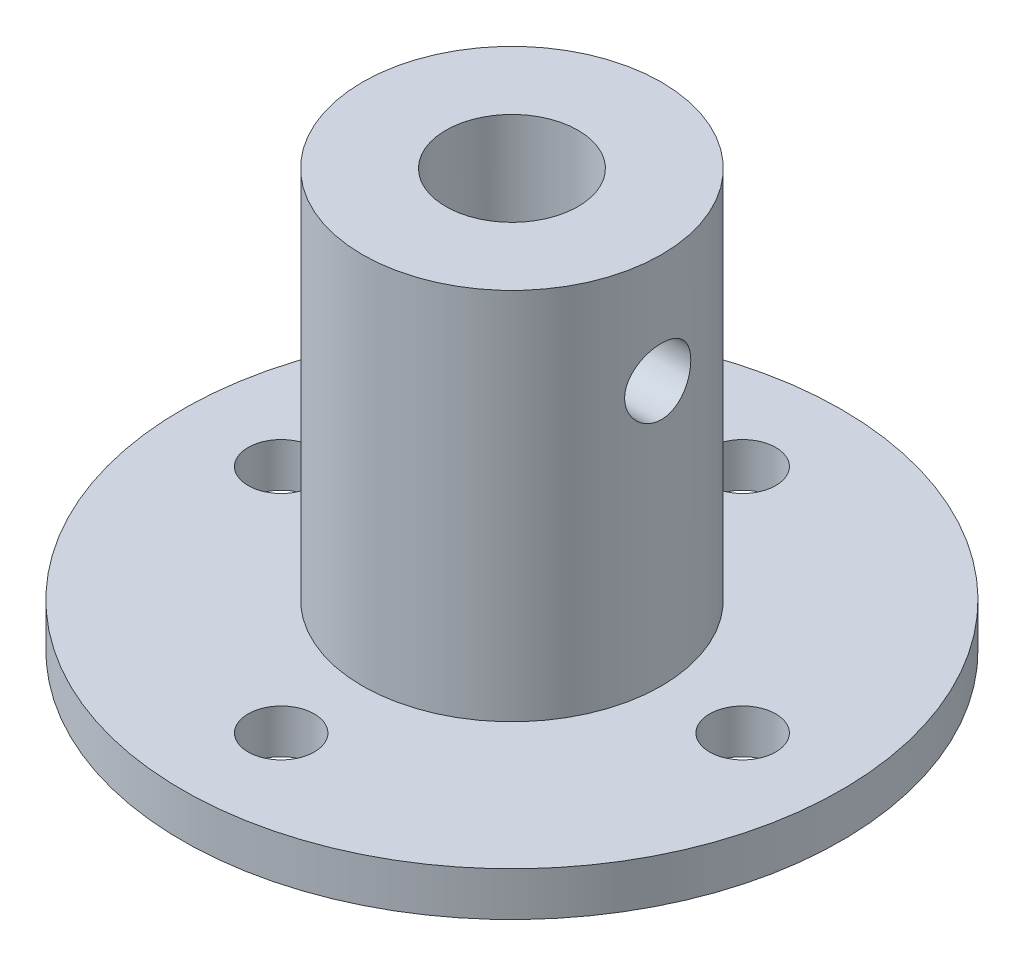
ISO-10303-21;
HEADER;
FILE_DESCRIPTION(('STEP AP214'),'2;1');
FILE_NAME('part.step','',(''),(''),'','','');
FILE_SCHEMA(('AUTOMOTIVE_DESIGN { 1 0 10303 214 1 1 1 1 }'));
ENDSEC;
DATA;
#1=APPLICATION_CONTEXT('core data for automotive mechanical design processes');
#2=APPLICATION_PROTOCOL_DEFINITION('international standard','automotive_design',2000,#1);
#3=PRODUCT_CONTEXT('',#1,'mechanical');
#4=PRODUCT('Part','Part','',(#3));
#5=PRODUCT_RELATED_PRODUCT_CATEGORY('part','',(#4));
#6=PRODUCT_DEFINITION_FORMATION('','',#4);
#7=PRODUCT_DEFINITION_CONTEXT('part definition',#1,'design');
#8=PRODUCT_DEFINITION('design','',#6,#7);
#9=PRODUCT_DEFINITION_SHAPE('','',#8);
#10=(LENGTH_UNIT() NAMED_UNIT(*) SI_UNIT(.MILLI.,.METRE.));
#11=(NAMED_UNIT(*) PLANE_ANGLE_UNIT() SI_UNIT($,.RADIAN.));
#12=(NAMED_UNIT(*) SI_UNIT($,.STERADIAN.) SOLID_ANGLE_UNIT());
#13=UNCERTAINTY_MEASURE_WITH_UNIT(LENGTH_MEASURE(1.E-05),#10,'distance_accuracy_value','');
#14=(GEOMETRIC_REPRESENTATION_CONTEXT(3) GLOBAL_UNCERTAINTY_ASSIGNED_CONTEXT((#13)) GLOBAL_UNIT_ASSIGNED_CONTEXT((#10,
#11,#12)) REPRESENTATION_CONTEXT('',''));
#15=CARTESIAN_POINT('',(0.,0.,0.));
#16=DIRECTION('',(0.,0.,1.));
#17=DIRECTION('',(1.,0.,0.));
#18=AXIS2_PLACEMENT_3D('',#15,#16,#17);
#19=CARTESIAN_POINT('',(0.,1.5875,-21.8080060784619));
#20=DIRECTION('',(0.,1.,0.));
#21=DIRECTION('',(0.,0.,1.));
#22=AXIS2_PLACEMENT_3D('',#19,#20,#21);
#23=PLANE('',#22);
#24=CARTESIAN_POINT('',(8.3312,1.5875,0.));
#25=DIRECTION('',(0.,1.,0.));
#26=DIRECTION('',(0.,0.,1.));
#27=AXIS2_PLACEMENT_3D('',#24,#25,#26);
#28=CIRCLE('',#27,1.1938);
#29=CARTESIAN_POINT('',(8.3312,1.5875,1.1938));
#30=VERTEX_POINT('',#29);
#31=EDGE_CURVE('E129',#30,#30,#28,.F.);
#32=ORIENTED_EDGE('',*,*,#31,.F.);
#33=EDGE_LOOP('',(#32));
#34=FACE_BOUND('',#33,.T.);
#35=CARTESIAN_POINT('',(-8.3312,1.5875,0.));
#36=DIRECTION('',(0.,1.,0.));
#37=DIRECTION('',(0.,0.,1.));
#38=AXIS2_PLACEMENT_3D('',#35,#36,#37);
#39=CIRCLE('',#38,1.1938);
#40=CARTESIAN_POINT('',(-8.3312,1.5875,1.1938));
#41=VERTEX_POINT('',#40);
#42=EDGE_CURVE('E56',#41,#41,#39,.F.);
#43=ORIENTED_EDGE('',*,*,#42,.F.);
#44=EDGE_LOOP('',(#43));
#45=FACE_BOUND('',#44,.T.);
#46=CARTESIAN_POINT('',(0.,1.5875,0.));
#47=DIRECTION('',(0.,-1.,0.));
#48=DIRECTION('',(0.,0.,-1.));
#49=AXIS2_PLACEMENT_3D('',#46,#47,#48);
#50=CIRCLE('',#49,3.9243);
#51=CARTESIAN_POINT('',(0.,1.5875,-3.9243));
#52=VERTEX_POINT('',#51);
#53=EDGE_CURVE('E39',#52,#52,#50,.T.);
#54=ORIENTED_EDGE('',*,*,#53,.F.);
#55=EDGE_LOOP('',(#54));
#56=FACE_BOUND('',#55,.T.);
#57=CARTESIAN_POINT('',(0.,1.5875,0.));
#58=DIRECTION('',(0.,-1.,0.));
#59=DIRECTION('',(0.,0.,-1.));
#60=AXIS2_PLACEMENT_3D('',#57,#58,#59);
#61=CIRCLE('',#60,11.8999);
#62=CARTESIAN_POINT('',(0.,1.5875,-11.8999));
#63=VERTEX_POINT('',#62);
#64=EDGE_CURVE('E44',#63,#63,#61,.T.);
#65=ORIENTED_EDGE('',*,*,#64,.T.);
#66=EDGE_LOOP('',(#65));
#67=FACE_BOUND('',#66,.T.);
#68=CARTESIAN_POINT('',(0.,1.5875,-8.3312));
#69=DIRECTION('',(0.,1.,0.));
#70=DIRECTION('',(0.,0.,1.));
#71=AXIS2_PLACEMENT_3D('',#68,#69,#70);
#72=CIRCLE('',#71,1.1938);
#73=CARTESIAN_POINT('',(0.,1.5875,-7.1374));
#74=VERTEX_POINT('',#73);
#75=EDGE_CURVE('E121',#74,#74,#72,.F.);
#76=ORIENTED_EDGE('',*,*,#75,.F.);
#77=EDGE_LOOP('',(#76));
#78=FACE_BOUND('',#77,.T.);
#79=CARTESIAN_POINT('',(0.,1.5875,8.3312));
#80=DIRECTION('',(0.,1.,0.));
#81=DIRECTION('',(0.,0.,1.));
#82=AXIS2_PLACEMENT_3D('',#79,#80,#81);
#83=CIRCLE('',#82,1.1938);
#84=CARTESIAN_POINT('',(0.,1.5875,9.525));
#85=VERTEX_POINT('',#84);
#86=EDGE_CURVE('E124',#85,#85,#83,.F.);
#87=ORIENTED_EDGE('',*,*,#86,.F.);
#88=EDGE_LOOP('',(#87));
#89=FACE_BOUND('',#88,.T.);
#90=ADVANCED_FACE('F31',(#34,#45,#56,#67,#78,#89),#23,.F.);
#91=CARTESIAN_POINT('',(0.,3.175,-21.8080060784619));
#92=DIRECTION('',(0.,-1.,0.));
#93=DIRECTION('',(0.,0.,-1.));
#94=AXIS2_PLACEMENT_3D('',#91,#92,#93);
#95=PLANE('',#94);
#96=CARTESIAN_POINT('',(8.3312,3.175,0.));
#97=DIRECTION('',(0.,-1.,0.));
#98=DIRECTION('',(0.,0.,-1.));
#99=AXIS2_PLACEMENT_3D('',#96,#97,#98);
#100=CIRCLE('',#99,1.1938);
#101=CARTESIAN_POINT('',(8.3312,3.175,-1.1938));
#102=VERTEX_POINT('',#101);
#103=EDGE_CURVE('E126',#102,#102,#100,.F.);
#104=ORIENTED_EDGE('',*,*,#103,.F.);
#105=EDGE_LOOP('',(#104));
#106=FACE_BOUND('',#105,.T.);
#107=CARTESIAN_POINT('',(-8.3312,3.175,0.));
#108=DIRECTION('',(0.,-1.,0.));
#109=DIRECTION('',(0.,0.,-1.));
#110=AXIS2_PLACEMENT_3D('',#107,#108,#109);
#111=CIRCLE('',#110,1.1938);
#112=CARTESIAN_POINT('',(-8.3312,3.175,-1.1938));
#113=VERTEX_POINT('',#112);
#114=EDGE_CURVE('E134',#113,#113,#111,.F.);
#115=ORIENTED_EDGE('',*,*,#114,.F.);
#116=EDGE_LOOP('',(#115));
#117=FACE_BOUND('',#116,.T.);
#118=CARTESIAN_POINT('',(0.,3.175,0.));
#119=DIRECTION('',(0.,-1.,0.));
#120=DIRECTION('',(0.,0.,-1.));
#121=AXIS2_PLACEMENT_3D('',#118,#119,#120);
#122=CIRCLE('',#121,11.8999);
#123=CARTESIAN_POINT('',(0.,3.175,-11.8999));
#124=VERTEX_POINT('',#123);
#125=EDGE_CURVE('E172',#124,#124,#122,.T.);
#126=ORIENTED_EDGE('',*,*,#125,.F.);
#127=EDGE_LOOP('',(#126));
#128=FACE_BOUND('',#127,.T.);
#129=CARTESIAN_POINT('',(0.,3.175,0.));
#130=DIRECTION('',(0.,-1.,0.));
#131=DIRECTION('',(0.,0.,-1.));
#132=AXIS2_PLACEMENT_3D('',#129,#130,#131);
#133=CIRCLE('',#132,5.3975);
#134=CARTESIAN_POINT('',(0.,3.175,-5.3975));
#135=VERTEX_POINT('',#134);
#136=EDGE_CURVE('E175',#135,#135,#133,.T.);
#137=ORIENTED_EDGE('',*,*,#136,.T.);
#138=EDGE_LOOP('',(#137));
#139=FACE_BOUND('',#138,.T.);
#140=CARTESIAN_POINT('',(0.,3.175,-8.3312));
#141=DIRECTION('',(0.,-1.,0.));
#142=DIRECTION('',(0.,0.,-1.));
#143=AXIS2_PLACEMENT_3D('',#140,#141,#142);
#144=CIRCLE('',#143,1.1938);
#145=CARTESIAN_POINT('',(0.,3.175,-9.525));
#146=VERTEX_POINT('',#145);
#147=EDGE_CURVE('E133',#146,#146,#144,.F.);
#148=ORIENTED_EDGE('',*,*,#147,.F.);
#149=EDGE_LOOP('',(#148));
#150=FACE_BOUND('',#149,.T.);
#151=CARTESIAN_POINT('',(0.,3.175,8.3312));
#152=DIRECTION('',(0.,-1.,0.));
#153=DIRECTION('',(0.,0.,-1.));
#154=AXIS2_PLACEMENT_3D('',#151,#152,#153);
#155=CIRCLE('',#154,1.1938);
#156=CARTESIAN_POINT('',(0.,3.175,7.1374));
#157=VERTEX_POINT('',#156);
#158=EDGE_CURVE('E35',#157,#157,#155,.F.);
#159=ORIENTED_EDGE('',*,*,#158,.F.);
#160=EDGE_LOOP('',(#159));
#161=FACE_BOUND('',#160,.T.);
#162=ADVANCED_FACE('F94',(#106,#117,#128,#139,#150,#161),#95,.F.);
#163=CARTESIAN_POINT('',(0.,0.,-21.8080060784619));
#164=DIRECTION('',(0.,1.,0.));
#165=DIRECTION('',(0.,0.,1.));
#166=AXIS2_PLACEMENT_3D('',#163,#164,#165);
#167=PLANE('',#166);
#168=CARTESIAN_POINT('',(0.,0.,0.));
#169=DIRECTION('',(0.,-1.,0.));
#170=DIRECTION('',(0.,0.,-1.));
#171=AXIS2_PLACEMENT_3D('',#168,#169,#170);
#172=CIRCLE('',#171,2.3876);
#173=CARTESIAN_POINT('',(0.,0.,-2.3876));
#174=VERTEX_POINT('',#173);
#175=EDGE_CURVE('E185',#174,#174,#172,.T.);
#176=ORIENTED_EDGE('',*,*,#175,.F.);
#177=EDGE_LOOP('',(#176));
#178=FACE_BOUND('',#177,.T.);
#179=CARTESIAN_POINT('',(0.,0.,0.));
#180=DIRECTION('',(0.,-1.,0.));
#181=DIRECTION('',(0.,0.,-1.));
#182=AXIS2_PLACEMENT_3D('',#179,#180,#181);
#183=CIRCLE('',#182,3.9243);
#184=CARTESIAN_POINT('',(0.,0.,-3.9243));
#185=VERTEX_POINT('',#184);
#186=EDGE_CURVE('E10',#185,#185,#183,.T.);
#187=ORIENTED_EDGE('',*,*,#186,.T.);
#188=EDGE_LOOP('',(#187));
#189=FACE_BOUND('',#188,.T.);
#190=ADVANCED_FACE('F33',(#178,#189),#167,.F.);
#191=CARTESIAN_POINT('',(0.,0.,0.));
#192=DIRECTION('',(0.,-1.,0.));
#193=DIRECTION('',(0.,0.,-1.));
#194=AXIS2_PLACEMENT_3D('',#191,#192,#193);
#195=CYLINDRICAL_SURFACE('',#194,3.9243);
#196=ORIENTED_EDGE('',*,*,#186,.F.);
#197=EDGE_LOOP('',(#196));
#198=FACE_BOUND('',#197,.T.);
#199=ORIENTED_EDGE('',*,*,#53,.T.);
#200=EDGE_LOOP('',(#199));
#201=FACE_BOUND('',#200,.T.);
#202=ADVANCED_FACE('F101',(#198,#201),#195,.T.);
#203=CARTESIAN_POINT('',(0.,0.,0.));
#204=DIRECTION('',(0.,-1.,0.));
#205=DIRECTION('',(0.,0.,-1.));
#206=AXIS2_PLACEMENT_3D('',#203,#204,#205);
#207=CYLINDRICAL_SURFACE('',#206,11.8999);
#208=ORIENTED_EDGE('',*,*,#64,.F.);
#209=EDGE_LOOP('',(#208));
#210=FACE_BOUND('',#209,.T.);
#211=ORIENTED_EDGE('',*,*,#125,.T.);
#212=EDGE_LOOP('',(#211));
#213=FACE_BOUND('',#212,.T.);
#214=ADVANCED_FACE('F92',(#210,#213),#207,.T.);
#215=CARTESIAN_POINT('',(0.,0.,0.));
#216=DIRECTION('',(0.,-1.,0.));
#217=DIRECTION('',(0.,0.,-1.));
#218=AXIS2_PLACEMENT_3D('',#215,#216,#217);
#219=CYLINDRICAL_SURFACE('',#218,5.3975);
#220=CARTESIAN_POINT('',(-5.26382444711067,12.7,-1.1938));
#221=CARTESIAN_POINT('',(-5.26382578415347,12.7661702685941,-1.19379774984588));
#222=CARTESIAN_POINT('',(-5.26508575545003,12.8323674141414,-1.1882797309663));
#223=CARTESIAN_POINT('',(-5.26997997867348,12.9628778214841,-1.16637841218524));
#224=CARTESIAN_POINT('',(-5.27361592215716,13.0271897069721,-1.14998737118579));
#225=CARTESIAN_POINT('',(-5.28283061311481,13.1520228509558,-1.10688248680728));
#226=CARTESIAN_POINT('',(-5.2884072006729,13.2125482357961,-1.08018011621852));
#227=CARTESIAN_POINT('',(-5.30087223338352,13.328261867473,-1.01724355777763));
#228=CARTESIAN_POINT('',(-5.30776065774752,13.3834501988645,-0.981009520969179));
#229=CARTESIAN_POINT('',(-5.32220613392169,13.4878769294094,-0.899371098034646));
#230=CARTESIAN_POINT('',(-5.32977190142588,13.5370097292132,-0.8538331544698));
#231=CARTESIAN_POINT('',(-5.34464334205277,13.6270054491259,-0.755167843248626));
#232=CARTESIAN_POINT('',(-5.35194899463663,13.6678677173761,-0.702039877931926));
#233=CARTESIAN_POINT('',(-5.36557208684666,13.740581218177,-0.588993479205267));
#234=CARTESIAN_POINT('',(-5.37187804298682,13.7723307223337,-0.529008109283108));
#235=CARTESIAN_POINT('',(-5.38269270912959,13.8252590529265,-0.404390487241094));
#236=CARTESIAN_POINT('',(-5.38720162541889,13.8464390927282,-0.339758769493096));
#237=CARTESIAN_POINT('',(-5.3938525870581,13.8772946916617,-0.208781328778443));
#238=CARTESIAN_POINT('',(-5.39603137251229,13.8871490195043,-0.142479617233934));
#239=CARTESIAN_POINT('',(-5.39790393023066,13.895632565009,-0.00913067513711657));
#240=CARTESIAN_POINT('',(-5.39759799292244,13.894263094568,0.057916467370424));
#241=CARTESIAN_POINT('',(-5.39456360089335,13.8804707243369,0.189620119857848));
#242=CARTESIAN_POINT('',(-5.39187738295879,13.8682405339713,0.254297927469926));
#243=CARTESIAN_POINT('',(-5.38443245616669,13.8333811786812,0.380659749790105));
#244=CARTESIAN_POINT('',(-5.37967365222839,13.8107515366748,0.442343627006063));
#245=CARTESIAN_POINT('',(-5.36855057930608,13.7555662803426,0.561499548515559));
#246=CARTESIAN_POINT('',(-5.36217461019906,13.7229379514426,0.618936779227974));
#247=CARTESIAN_POINT('',(-5.34851578071422,13.6487358066008,0.727590737089718));
#248=CARTESIAN_POINT('',(-5.34123279425877,13.6071607464552,0.778806597494365));
#249=CARTESIAN_POINT('',(-5.32637742354258,13.5151972982437,0.87471039835053));
#250=CARTESIAN_POINT('',(-5.31880217870766,13.4646402597448,0.9192363191774));
#251=CARTESIAN_POINT('',(-5.30436094157517,13.3566983480059,0.999208447324352));
#252=CARTESIAN_POINT('',(-5.29749496939257,13.2993132812222,1.03465439717848));
#253=CARTESIAN_POINT('',(-5.28524189323355,13.1790782350536,1.09553468711881));
#254=CARTESIAN_POINT('',(-5.27985941819434,13.1162119382469,1.12093779540818));
#255=CARTESIAN_POINT('',(-5.27124647395836,12.9869553942399,1.16076978074624));
#256=CARTESIAN_POINT('',(-5.26801565487397,12.9205657218837,1.17520044211354));
#257=CARTESIAN_POINT('',(-5.26414334960272,12.7876290680902,1.19242531072601));
#258=CARTESIAN_POINT('',(-5.26344931699878,12.7211141839457,1.19545569988305));
#259=CARTESIAN_POINT('',(-5.26458732330362,12.5885296153253,1.19043397004535));
#260=CARTESIAN_POINT('',(-5.26641918444991,12.5224598998489,1.18238263093924));
#261=CARTESIAN_POINT('',(-5.27235289802696,12.3934675071958,1.15563107848453));
#262=CARTESIAN_POINT('',(-5.27642688785295,12.3305163390316,1.13706149274304));
#263=CARTESIAN_POINT('',(-5.2863605903461,12.2086189415852,1.08994225559975));
#264=CARTESIAN_POINT('',(-5.29222047708606,12.149673103391,1.06139163129826));
#265=CARTESIAN_POINT('',(-5.30518080244967,12.0364391143524,0.994602353773198));
#266=CARTESIAN_POINT('',(-5.31229928674315,11.982238701375,0.956218524361973));
#267=CARTESIAN_POINT('',(-5.32692739394632,11.8809616620235,0.87104189418985));
#268=CARTESIAN_POINT('',(-5.33443706649221,11.8338859426455,0.824248024460122));
#269=CARTESIAN_POINT('',(-5.34917497399701,11.7472749207666,0.722509719120593));
#270=CARTESIAN_POINT('',(-5.35639509359001,11.7079008189224,0.667426675166462));
#271=CARTESIAN_POINT('',(-5.36958980353617,11.6389648036399,0.55129108882186));
#272=CARTESIAN_POINT('',(-5.37556445273891,11.6094024265496,0.490238828682533));
#273=CARTESIAN_POINT('',(-5.38556088659178,11.5611520564143,0.364282469944756));
#274=CARTESIAN_POINT('',(-5.38959516936264,11.5423943104059,0.299406128860069));
#275=CARTESIAN_POINT('',(-5.39531040949971,11.5160683519074,0.167323618069814));
#276=CARTESIAN_POINT('',(-5.39699171710073,11.5084984741202,0.10011779662831));
#277=CARTESIAN_POINT('',(-5.39780088062668,11.504839416257,-0.0331868714888969));
#278=CARTESIAN_POINT('',(-5.39698221905978,11.5085097756106,-0.0992789072242101));
#279=CARTESIAN_POINT('',(-5.39299831354787,11.5266881916768,-0.229879270685647));
#280=CARTESIAN_POINT('',(-5.38983311364613,11.5411960449754,-0.294387628113086));
#281=CARTESIAN_POINT('',(-5.38151606202691,11.5805213018768,-0.419798590757465));
#282=CARTESIAN_POINT('',(-5.37637092218423,11.6053038964672,-0.48071258459367));
#283=CARTESIAN_POINT('',(-5.36464281096966,11.664441476956,-0.597549436520733));
#284=CARTESIAN_POINT('',(-5.35805969667744,11.698797414443,-0.653471797714204));
#285=CARTESIAN_POINT('',(-5.34401403622104,11.7768867737438,-0.759908553552908));
#286=CARTESIAN_POINT('',(-5.33653693136061,11.8207888707088,-0.810297285973092));
#287=CARTESIAN_POINT('',(-5.3216234124524,11.9163850193007,-0.903074561644765));
#288=CARTESIAN_POINT('',(-5.31418700867946,11.9680809522167,-0.945461167750838));
#289=CARTESIAN_POINT('',(-5.30008278439156,12.0786517226949,-1.02159301434042));
#290=CARTESIAN_POINT('',(-5.29342692905017,12.1376154444118,-1.05521151093274));
#291=CARTESIAN_POINT('',(-5.28178853264086,12.2604909420044,-1.1120085881044));
#292=CARTESIAN_POINT('',(-5.27680459054452,12.3243985194823,-1.13519591537155));
#293=CARTESIAN_POINT('',(-5.26998548571928,12.4402994262764,-1.16638257437939));
#294=CARTESIAN_POINT('',(-5.26769057534933,12.4916689378175,-1.17664420182981));
#295=CARTESIAN_POINT('',(-5.26460956577482,12.5953533949017,-1.19035363082945));
#296=CARTESIAN_POINT('',(-5.26382338969116,12.6476682921345,-1.19380177956672));
#297=CARTESIAN_POINT('',(-5.26382444711067,12.7,-1.1938));
#298=B_SPLINE_CURVE_WITH_KNOTS('',3,(#220,#221,#222,#223,#224,#225,#226,#227,#228,#229,#230,
#231,#232,#233,#234,#235,#236,#237,#238,#239,#240,#241,#242,#243,#244,#245,#246,#247,#248,#249,
#250,#251,#252,#253,#254,#255,#256,#257,#258,#259,#260,#261,#262,#263,#264,#265,#266,#267,#268,
#269,#270,#271,#272,#273,#274,#275,#276,#277,#278,#279,#280,#281,#282,#283,#284,#285,#286,#287,
#288,#289,#290,#291,#292,#293,#294,#295,#296,#297),.UNSPECIFIED.,.T.,.F.,(4,2,2,2,2,2,2,2,2,2,2,
2,2,2,2,2,2,2,2,2,2,2,2,2,2,2,2,2,2,2,2,2,2,2,2,2,2,2,4),(0.,0.198318987053293,
0.396779319976053,0.595019471430783,0.793256481659141,0.994569177374323,1.19589773378243,
1.39939337351754,1.60286564674728,1.80308012505208,2.00327120156167,2.19997958211363,
2.39669698769732,2.59488039097799,2.7930913730513,2.9955183038815,3.19795097396737,
3.40100831967772,3.60403263751931,3.8028269308147,4.00160723446165,4.1979713451246,
4.39435460167822,4.5938235678414,4.7933179057142,4.99662269227714,5.19991787032853,
5.40188545717413,5.60382297842302,5.80147088332305,5.99911507857167,6.19609509179323,
6.39309469178263,6.5939083017002,6.79477046218211,6.99839266255881,7.20184380303858,
7.35869521677338,7.51553863777134),.UNSPECIFIED.);
#299=CARTESIAN_POINT('',(-5.26382444711067,12.7,-1.1938));
#300=VERTEX_POINT('',#299);
#301=EDGE_CURVE('E82',#300,#300,#298,.T.);
#302=ORIENTED_EDGE('',*,*,#301,.T.);
#303=EDGE_LOOP('',(#302));
#304=FACE_BOUND('',#303,.T.);
#305=CARTESIAN_POINT('',(5.26382444711067,12.7,-1.1938));
#306=CARTESIAN_POINT('',(5.26382578415347,12.6338297314059,-1.19379774984588));
#307=CARTESIAN_POINT('',(5.26508575545003,12.5676325858586,-1.1882797309663));
#308=CARTESIAN_POINT('',(5.26997997867348,12.4371221785159,-1.16637841218524));
#309=CARTESIAN_POINT('',(5.27361592215716,12.3728102930279,-1.14998737118579));
#310=CARTESIAN_POINT('',(5.28283061311481,12.2479771490442,-1.10688248680728));
#311=CARTESIAN_POINT('',(5.2884072006729,12.1874517642039,-1.08018011621852));
#312=CARTESIAN_POINT('',(5.30087223338352,12.071738132527,-1.01724355777763));
#313=CARTESIAN_POINT('',(5.30776065774752,12.0165498011355,-0.981009520969178));
#314=CARTESIAN_POINT('',(5.32220613392169,11.9121230705906,-0.899371098034646));
#315=CARTESIAN_POINT('',(5.32977190142588,11.8629902707868,-0.8538331544698));
#316=CARTESIAN_POINT('',(5.34464334205277,11.7729945508741,-0.755167843248626));
#317=CARTESIAN_POINT('',(5.35194899463663,11.7321322826239,-0.702039877931926));
#318=CARTESIAN_POINT('',(5.36557208684666,11.659418781823,-0.588993479205267));
#319=CARTESIAN_POINT('',(5.37187804298682,11.6276692776663,-0.529008109283107));
#320=CARTESIAN_POINT('',(5.38269270912959,11.5747409470735,-0.404390487241093));
#321=CARTESIAN_POINT('',(5.38720162541889,11.5535609072718,-0.339758769493095));
#322=CARTESIAN_POINT('',(5.3938525870581,11.5227053083383,-0.208781328778443));
#323=CARTESIAN_POINT('',(5.39603137251229,11.5128509804957,-0.142479617233934));
#324=CARTESIAN_POINT('',(5.39790393023066,11.504367434991,-0.0091306751371166));
#325=CARTESIAN_POINT('',(5.39759799292244,11.505736905432,0.057916467370424));
#326=CARTESIAN_POINT('',(5.39456360089335,11.5195292756631,0.189620119857848));
#327=CARTESIAN_POINT('',(5.39187738295879,11.5317594660287,0.254297927469926));
#328=CARTESIAN_POINT('',(5.38443245616669,11.5666188213188,0.380659749790105));
#329=CARTESIAN_POINT('',(5.37967365222839,11.5892484633252,0.442343627006063));
#330=CARTESIAN_POINT('',(5.36855057930608,11.6444337196574,0.561499548515559));
#331=CARTESIAN_POINT('',(5.36217461019906,11.6770620485574,0.618936779227974));
#332=CARTESIAN_POINT('',(5.34851578071422,11.7512641933992,0.727590737089719));
#333=CARTESIAN_POINT('',(5.34123279425877,11.7928392535448,0.778806597494365));
#334=CARTESIAN_POINT('',(5.32637742354258,11.8848027017563,0.874710398350531));
#335=CARTESIAN_POINT('',(5.31880217870766,11.9353597402552,0.9192363191774));
#336=CARTESIAN_POINT('',(5.30436094157517,12.0433016519941,0.999208447324352));
#337=CARTESIAN_POINT('',(5.29749496939257,12.1006867187778,1.03465439717848));
#338=CARTESIAN_POINT('',(5.28524189323355,12.2209217649464,1.09553468711881));
#339=CARTESIAN_POINT('',(5.27985941819434,12.2837880617531,1.12093779540818));
#340=CARTESIAN_POINT('',(5.27124647395836,12.4130446057601,1.16076978074624));
#341=CARTESIAN_POINT('',(5.26801565487397,12.4794342781163,1.17520044211354));
#342=CARTESIAN_POINT('',(5.26414334960272,12.6123709319098,1.19242531072601));
#343=CARTESIAN_POINT('',(5.26344931699878,12.6788858160543,1.19545569988305));
#344=CARTESIAN_POINT('',(5.26458732330362,12.8114703846747,1.19043397004535));
#345=CARTESIAN_POINT('',(5.26641918444991,12.8775401001511,1.18238263093924));
#346=CARTESIAN_POINT('',(5.27235289802696,13.0065324928042,1.15563107848453));
#347=CARTESIAN_POINT('',(5.27642688785295,13.0694836609684,1.13706149274304));
#348=CARTESIAN_POINT('',(5.2863605903461,13.1913810584148,1.08994225559975));
#349=CARTESIAN_POINT('',(5.29222047708606,13.250326896609,1.06139163129826));
#350=CARTESIAN_POINT('',(5.30518080244967,13.3635608856476,0.994602353773198));
#351=CARTESIAN_POINT('',(5.31229928674315,13.417761298625,0.956218524361973));
#352=CARTESIAN_POINT('',(5.32692739394632,13.5190383379765,0.87104189418985));
#353=CARTESIAN_POINT('',(5.33443706649221,13.5661140573545,0.824248024460122));
#354=CARTESIAN_POINT('',(5.34917497399701,13.6527250792334,0.722509719120593));
#355=CARTESIAN_POINT('',(5.35639509359001,13.6920991810776,0.667426675166462));
#356=CARTESIAN_POINT('',(5.36958980353617,13.7610351963601,0.55129108882186));
#357=CARTESIAN_POINT('',(5.37556445273891,13.7905975734504,0.490238828682533));
#358=CARTESIAN_POINT('',(5.38556088659178,13.8388479435857,0.364282469944756));
#359=CARTESIAN_POINT('',(5.38959516936264,13.8576056895941,0.299406128860069));
#360=CARTESIAN_POINT('',(5.39531040949971,13.8839316480926,0.167323618069814));
#361=CARTESIAN_POINT('',(5.39699171710073,13.8915015258798,0.10011779662831));
#362=CARTESIAN_POINT('',(5.39780088062668,13.895160583743,-0.0331868714888969));
#363=CARTESIAN_POINT('',(5.39698221905978,13.8914902243894,-0.0992789072242101));
#364=CARTESIAN_POINT('',(5.39299831354787,13.8733118083232,-0.229879270685647));
#365=CARTESIAN_POINT('',(5.38983311364613,13.8588039550246,-0.294387628113086));
#366=CARTESIAN_POINT('',(5.38151606202691,13.8194786981232,-0.419798590757465));
#367=CARTESIAN_POINT('',(5.37637092218423,13.7946961035328,-0.48071258459367));
#368=CARTESIAN_POINT('',(5.36464281096966,13.7355585230441,-0.597549436520733));
#369=CARTESIAN_POINT('',(5.35805969667744,13.701202585557,-0.653471797714204));
#370=CARTESIAN_POINT('',(5.34401403622104,13.6231132262562,-0.759908553552908));
#371=CARTESIAN_POINT('',(5.33653693136061,13.5792111292912,-0.810297285973092));
#372=CARTESIAN_POINT('',(5.3216234124524,13.4836149806993,-0.903074561644765));
#373=CARTESIAN_POINT('',(5.31418700867946,13.4319190477832,-0.945461167750838));
#374=CARTESIAN_POINT('',(5.30008278439156,13.3213482773051,-1.02159301434042));
#375=CARTESIAN_POINT('',(5.29342692905017,13.2623845555882,-1.05521151093274));
#376=CARTESIAN_POINT('',(5.28178853264086,13.1395090579956,-1.1120085881044));
#377=CARTESIAN_POINT('',(5.27680459054452,13.0756014805177,-1.13519591537155));
#378=CARTESIAN_POINT('',(5.26998548571928,12.9597005737236,-1.16638257437939));
#379=CARTESIAN_POINT('',(5.26769057534933,12.9083310621825,-1.17664420182981));
#380=CARTESIAN_POINT('',(5.26460956577482,12.8046466050983,-1.19035363082945));
#381=CARTESIAN_POINT('',(5.26382338969116,12.7523317078655,-1.19380177956672));
#382=CARTESIAN_POINT('',(5.26382444711067,12.7,-1.1938));
#383=B_SPLINE_CURVE_WITH_KNOTS('',3,(#305,#306,#307,#308,#309,#310,#311,#312,#313,#314,#315,
#316,#317,#318,#319,#320,#321,#322,#323,#324,#325,#326,#327,#328,#329,#330,#331,#332,#333,#334,
#335,#336,#337,#338,#339,#340,#341,#342,#343,#344,#345,#346,#347,#348,#349,#350,#351,#352,#353,
#354,#355,#356,#357,#358,#359,#360,#361,#362,#363,#364,#365,#366,#367,#368,#369,#370,#371,#372,
#373,#374,#375,#376,#377,#378,#379,#380,#381,#382),.UNSPECIFIED.,.T.,.F.,(4,2,2,2,2,2,2,2,2,2,2,
2,2,2,2,2,2,2,2,2,2,2,2,2,2,2,2,2,2,2,2,2,2,2,2,2,2,2,4),(0.,0.198318987053293,
0.396779319976053,0.595019471430787,0.793256481659141,0.994569177374323,1.19589773378243,
1.39939337351754,1.60286564674728,1.80308012505208,2.00327120156167,2.19997958211363,
2.39669698769732,2.59488039097799,2.7930913730513,2.9955183038815,3.19795097396737,
3.40100831967772,3.60403263751931,3.8028269308147,4.00160723446165,4.1979713451246,
4.39435460167822,4.5938235678414,4.7933179057142,4.99662269227714,5.19991787032853,
5.40188545717413,5.60382297842302,5.80147088332305,5.99911507857167,6.19609509179323,
6.39309469178263,6.5939083017002,6.79477046218211,6.99839266255881,7.20184380303858,
7.35869521677338,7.51553863777134),.UNSPECIFIED.);
#384=CARTESIAN_POINT('',(5.26382444711067,12.7,-1.1938));
#385=VERTEX_POINT('',#384);
#386=EDGE_CURVE('E76',#385,#385,#383,.T.);
#387=ORIENTED_EDGE('',*,*,#386,.T.);
#388=EDGE_LOOP('',(#387));
#389=FACE_BOUND('',#388,.T.);
#390=ORIENTED_EDGE('',*,*,#136,.F.);
#391=EDGE_LOOP('',(#390));
#392=FACE_BOUND('',#391,.T.);
#393=CARTESIAN_POINT('',(0.,16.6624,0.));
#394=DIRECTION('',(0.,-1.,0.));
#395=DIRECTION('',(0.,0.,-1.));
#396=AXIS2_PLACEMENT_3D('',#393,#394,#395);
#397=CIRCLE('',#396,5.3975);
#398=CARTESIAN_POINT('',(0.,16.6624,-5.3975));
#399=VERTEX_POINT('',#398);
#400=EDGE_CURVE('E177',#399,#399,#397,.T.);
#401=ORIENTED_EDGE('',*,*,#400,.T.);
#402=EDGE_LOOP('',(#401));
#403=FACE_BOUND('',#402,.T.);
#404=ADVANCED_FACE('F87',(#304,#389,#392,#403),#219,.T.);
#405=CARTESIAN_POINT('',(0.,16.6624,-21.8080060784619));
#406=DIRECTION('',(0.,-1.,0.));
#407=DIRECTION('',(0.,0.,-1.));
#408=AXIS2_PLACEMENT_3D('',#405,#406,#407);
#409=PLANE('',#408);
#410=ORIENTED_EDGE('',*,*,#400,.F.);
#411=EDGE_LOOP('',(#410));
#412=FACE_BOUND('',#411,.T.);
#413=CARTESIAN_POINT('',(0.,16.6624,0.));
#414=DIRECTION('',(0.,-1.,0.));
#415=DIRECTION('',(0.,0.,-1.));
#416=AXIS2_PLACEMENT_3D('',#413,#414,#415);
#417=CIRCLE('',#416,2.3876);
#418=CARTESIAN_POINT('',(0.,16.6624,-2.3876));
#419=VERTEX_POINT('',#418);
#420=EDGE_CURVE('E181',#419,#419,#417,.T.);
#421=ORIENTED_EDGE('',*,*,#420,.T.);
#422=EDGE_LOOP('',(#421));
#423=FACE_BOUND('',#422,.T.);
#424=ADVANCED_FACE('F91',(#412,#423),#409,.F.);
#425=CARTESIAN_POINT('',(0.,0.,0.));
#426=DIRECTION('',(0.,-1.,0.));
#427=DIRECTION('',(0.,0.,-1.));
#428=AXIS2_PLACEMENT_3D('',#425,#426,#427);
#429=CYLINDRICAL_SURFACE('',#428,2.3876);
#430=CARTESIAN_POINT('',(-2.06772225407573,12.7,-1.1938));
#431=CARTESIAN_POINT('',(-2.06772767358835,12.6377936985765,-1.19379565823838));
#432=CARTESIAN_POINT('',(-2.07057209857944,12.5755088509214,-1.18890538506131));
#433=CARTESIAN_POINT('',(-2.0815379307046,12.4528508514284,-1.1695935679763));
#434=CARTESIAN_POINT('',(-2.08967042583527,12.3924819966212,-1.15515199586478));
#435=CARTESIAN_POINT('',(-2.11003369977525,12.2756618031062,-1.11751611875784));
#436=CARTESIAN_POINT('',(-2.12224265498368,12.219191495877,-1.09436834128702));
#437=CARTESIAN_POINT('',(-2.14934933258365,12.1109501876563,-1.04011917179431));
#438=CARTESIAN_POINT('',(-2.16424720042126,12.0591794410967,-1.00901734949191));
#439=CARTESIAN_POINT('',(-2.19655462280774,11.957091421248,-0.936734916085764));
#440=CARTESIAN_POINT('',(-2.21406999170989,11.9072462038329,-0.894934600748433));
#441=CARTESIAN_POINT('',(-2.24878473049575,11.8149066659201,-0.803730395530152));
#442=CARTESIAN_POINT('',(-2.26598393895746,11.7724160121078,-0.754322735998901));
#443=CARTESIAN_POINT('',(-2.29951519186431,11.6931882949599,-0.645236440804285));
#444=CARTESIAN_POINT('',(-2.31571063442014,11.6570321319293,-0.585089962243212));
#445=CARTESIAN_POINT('',(-2.34403532631618,11.5955668493952,-0.458606658354489));
#446=CARTESIAN_POINT('',(-2.35616714075151,11.5702508843834,-0.392273772029331));
#447=CARTESIAN_POINT('',(-2.37423494633371,11.5330549353387,-0.260302054058833));
#448=CARTESIAN_POINT('',(-2.38055037487701,11.5203470954368,-0.194949677485552));
#449=CARTESIAN_POINT('',(-2.38769053595435,11.5060016875257,-0.0627588165394923));
#450=CARTESIAN_POINT('',(-2.38851859071443,11.5043574212773,0.0040787440562539));
#451=CARTESIAN_POINT('',(-2.38477047811858,11.5118665793858,0.131118067657072));
#452=CARTESIAN_POINT('',(-2.38065800396061,11.5200934629292,0.191391447577252));
#453=CARTESIAN_POINT('',(-2.36819173991086,11.5454531514534,0.309568780916092));
#454=CARTESIAN_POINT('',(-2.35983763264461,11.5625866228598,0.367472556681927));
#455=CARTESIAN_POINT('',(-2.33950876128802,11.605383967398,0.480276951655732));
#456=CARTESIAN_POINT('',(-2.32748550297558,11.6311625826648,0.535124936992419));
#457=CARTESIAN_POINT('',(-2.30090201778907,11.6903596662613,0.639849105646611));
#458=CARTESIAN_POINT('',(-2.28634088308805,11.7237808697703,0.689723499783575));
#459=CARTESIAN_POINT('',(-2.254424380338,11.8009436706601,0.788115316380264));
#460=CARTESIAN_POINT('',(-2.23693499066621,11.8453621952156,0.83605881877005));
#461=CARTESIAN_POINT('',(-2.20201591792536,11.9414472136216,0.924125797261489));
#462=CARTESIAN_POINT('',(-2.18458629083508,11.9931192318208,0.964243256777316));
#463=CARTESIAN_POINT('',(-2.15056093543208,12.1062614121159,1.03801546849587));
#464=CARTESIAN_POINT('',(-2.13408845204907,12.1681454143221,1.0710980306208));
#465=CARTESIAN_POINT('',(-2.10557012542564,12.2976149920684,1.12613435710087));
#466=CARTESIAN_POINT('',(-2.09351966668995,12.3651945317364,1.14809973417216));
#467=CARTESIAN_POINT('',(-2.07655106238376,12.4985038835694,1.17849573592169));
#468=CARTESIAN_POINT('',(-2.07114338751935,12.5639558879142,1.18786099078683));
#469=CARTESIAN_POINT('',(-2.06668172133889,12.6957039215024,1.19561093086472));
#470=CARTESIAN_POINT('',(-2.0676232418846,12.7619993214832,1.19400337256268));
#471=CARTESIAN_POINT('',(-2.0752343096215,12.8858196479993,1.18071122854403));
#472=CARTESIAN_POINT('',(-2.08126599565444,12.9435106687326,1.17014821559134));
#473=CARTESIAN_POINT('',(-2.09743522927991,13.0561914632503,1.14091022459421));
#474=CARTESIAN_POINT('',(-2.10757410646809,13.1111803558213,1.12223261952087));
#475=CARTESIAN_POINT('',(-2.13136541918694,13.2197940468316,1.07638689127651));
#476=CARTESIAN_POINT('',(-2.14515883703569,13.2732377103198,1.04886559323637));
#477=CARTESIAN_POINT('',(-2.17457975455817,13.3750572163632,0.986421497022067));
#478=CARTESIAN_POINT('',(-2.19020819455375,13.4234304364262,0.9514948966918));
#479=CARTESIAN_POINT('',(-2.22390612557174,13.5201152526696,0.870085810201992));
#480=CARTESIAN_POINT('',(-2.2420349896959,13.5676504385267,0.822701626089607));
#481=CARTESIAN_POINT('',(-2.27698529716608,13.6543383297167,0.720344286606477));
#482=CARTESIAN_POINT('',(-2.29380629766203,13.6934882035412,0.665368578043554));
#483=CARTESIAN_POINT('',(-2.32482237586664,13.7631669140392,0.547399515822645));
#484=CARTESIAN_POINT('',(-2.33893643428069,13.7934409565202,0.484232853883977));
#485=CARTESIAN_POINT('',(-2.36233149150414,13.842631229625,0.352794598908524));
#486=CARTESIAN_POINT('',(-2.37161673320854,13.8615574334011,0.28452754792198));
#487=CARTESIAN_POINT('',(-2.38363071267532,13.8858833919117,0.151588344766053));
#488=CARTESIAN_POINT('',(-2.38688285936799,13.8923649042209,0.0871610616686765));
#489=CARTESIAN_POINT('',(-2.38810295241832,13.8948066902995,-0.0419334020285457));
#490=CARTESIAN_POINT('',(-2.38607274858253,13.8907706471714,-0.106600490732273));
#491=CARTESIAN_POINT('',(-2.37726131998712,13.8730082935674,-0.229851855228209));
#492=CARTESIAN_POINT('',(-2.37080197654646,13.8599380429562,-0.288556165003086));
#493=CARTESIAN_POINT('',(-2.35407921415395,13.8253630282321,-0.402842977716802));
#494=CARTESIAN_POINT('',(-2.34381524968331,13.8038570545524,-0.458425031659885));
#495=CARTESIAN_POINT('',(-2.31986296127106,13.7520636451243,-0.567560462375143));
#496=CARTESIAN_POINT('',(-2.30604695211926,13.7214399639545,-0.620925395355315));
#497=CARTESIAN_POINT('',(-2.27643493344712,13.6527026221405,-0.721979967397583));
#498=CARTESIAN_POINT('',(-2.26063801573371,13.6145855213857,-0.769666983611916));
#499=CARTESIAN_POINT('',(-2.22677854888548,13.5275455754347,-0.863014738162497));
#500=CARTESIAN_POINT('',(-2.20864698060165,13.4779248624497,-0.908001515802984));
#501=CARTESIAN_POINT('',(-2.17346900323213,13.3715713291153,-0.989258232491765));
#502=CARTESIAN_POINT('',(-2.15642356390515,13.3148322836482,-1.02552045976201));
#503=CARTESIAN_POINT('',(-2.12495928813009,13.1934731713117,-1.08926022304811));
#504=CARTESIAN_POINT('',(-2.11064048027135,13.1286607133385,-1.11642393174417));
#505=CARTESIAN_POINT('',(-2.08755217424786,12.9944717756992,-1.15903500340875));
#506=CARTESIAN_POINT('',(-2.07876413277127,12.925111417216,-1.17452155202513));
#507=CARTESIAN_POINT('',(-2.07159245632018,12.8291627664226,-1.18707533398854));
#508=CARTESIAN_POINT('',(-2.0701462440635,12.8034214076678,-1.18959317410584));
#509=CARTESIAN_POINT('',(-2.06820998262796,12.7517912453615,-1.1929564669964));
#510=CARTESIAN_POINT('',(-2.06771999741435,12.7259024320625,-1.19380180789057));
#511=CARTESIAN_POINT('',(-2.06772225407573,12.7,-1.1938));
#512=B_SPLINE_CURVE_WITH_KNOTS('',3,(#430,#431,#432,#433,#434,#435,#436,#437,#438,#439,#440,
#441,#442,#443,#444,#445,#446,#447,#448,#449,#450,#451,#452,#453,#454,#455,#456,#457,#458,#459,
#460,#461,#462,#463,#464,#465,#466,#467,#468,#469,#470,#471,#472,#473,#474,#475,#476,#477,#478,
#479,#480,#481,#482,#483,#484,#485,#486,#487,#488,#489,#490,#491,#492,#493,#494,#495,#496,#497,
#498,#499,#500,#501,#502,#503,#504,#505,#506,#507,#508,#509,#510,#511),.UNSPECIFIED.,.T.,.F.,(4,
2,2,2,2,2,2,2,2,2,2,2,2,2,2,2,2,2,2,2,2,2,2,2,2,2,2,2,2,2,2,2,2,2,2,2,2,2,2,2,4),(0.,
0.186509907953573,0.373412155454251,0.559329437807967,0.745256779636419,0.946519028660391,
1.14788133160522,1.36281691754636,1.57761657229493,1.77713228354721,1.97652719076395,
2.15858257177042,2.34065157683338,2.52523958562043,2.70989375964355,2.91200281161236,
3.11426663595977,3.32937499256615,3.54425818653933,3.74211282821758,3.9398276244828,
4.11591420171601,4.29205782798172,4.47635958449587,4.66075619849492,4.86839690486536,
5.07610761610978,5.28930019770798,5.50230513735711,5.69576628390969,5.88915969214643,
6.06980954411588,6.25048530826641,6.43888864208906,6.62737867174238,6.83462726720611,
7.04205838568545,7.25604472202286,7.46930973778695,7.54696645384222,7.62462836443983),.UNSPECIFIED.);
#513=CARTESIAN_POINT('',(-2.06772225407573,12.7,-1.1938));
#514=VERTEX_POINT('',#513);
#515=EDGE_CURVE('E55',#514,#514,#512,.T.);
#516=ORIENTED_EDGE('',*,*,#515,.T.);
#517=EDGE_LOOP('',(#516));
#518=FACE_BOUND('',#517,.T.);
#519=CARTESIAN_POINT('',(2.06772225407573,12.7,-1.1938));
#520=CARTESIAN_POINT('',(2.06772767358835,12.7622063014235,-1.19379565823838));
#521=CARTESIAN_POINT('',(2.07057209857944,12.8244911490786,-1.18890538506131));
#522=CARTESIAN_POINT('',(2.0815379307046,12.9471491485716,-1.1695935679763));
#523=CARTESIAN_POINT('',(2.08967042583527,13.0075180033788,-1.15515199586478));
#524=CARTESIAN_POINT('',(2.11003369977525,13.1243381968938,-1.11751611875784));
#525=CARTESIAN_POINT('',(2.12224265498368,13.180808504123,-1.09436834128702));
#526=CARTESIAN_POINT('',(2.14934933258365,13.2890498123437,-1.04011917179431));
#527=CARTESIAN_POINT('',(2.16424720042126,13.3408205589033,-1.00901734949191));
#528=CARTESIAN_POINT('',(2.19655462280774,13.4429085787519,-0.936734916085764));
#529=CARTESIAN_POINT('',(2.21406999170989,13.4927537961671,-0.894934600748433));
#530=CARTESIAN_POINT('',(2.24878473049575,13.5850933340799,-0.803730395530152));
#531=CARTESIAN_POINT('',(2.26598393895746,13.6275839878922,-0.754322735998901));
#532=CARTESIAN_POINT('',(2.29951519186431,13.7068117050401,-0.645236440804285));
#533=CARTESIAN_POINT('',(2.31571063442014,13.7429678680707,-0.585089962243212));
#534=CARTESIAN_POINT('',(2.34403532631618,13.8044331506048,-0.458606658354489));
#535=CARTESIAN_POINT('',(2.35616714075151,13.8297491156166,-0.392273772029331));
#536=CARTESIAN_POINT('',(2.37423494633371,13.8669450646612,-0.260302054058833));
#537=CARTESIAN_POINT('',(2.38055037487701,13.8796529045632,-0.194949677485552));
#538=CARTESIAN_POINT('',(2.38769053595435,13.8939983124743,-0.0627588165394923));
#539=CARTESIAN_POINT('',(2.38851859071443,13.8956425787227,0.0040787440562539));
#540=CARTESIAN_POINT('',(2.38477047811858,13.8881334206142,0.131118067657072));
#541=CARTESIAN_POINT('',(2.38065800396061,13.8799065370708,0.191391447577252));
#542=CARTESIAN_POINT('',(2.36819173991086,13.8545468485466,0.309568780916092));
#543=CARTESIAN_POINT('',(2.35983763264461,13.8374133771402,0.367472556681927));
#544=CARTESIAN_POINT('',(2.33950876128802,13.794616032602,0.480276951655732));
#545=CARTESIAN_POINT('',(2.32748550297558,13.7688374173352,0.535124936992419));
#546=CARTESIAN_POINT('',(2.30090201778907,13.7096403337387,0.63984910564661));
#547=CARTESIAN_POINT('',(2.28634088308805,13.6762191302297,0.689723499783574));
#548=CARTESIAN_POINT('',(2.254424380338,13.5990563293399,0.788115316380264));
#549=CARTESIAN_POINT('',(2.23693499066621,13.5546378047844,0.83605881877005));
#550=CARTESIAN_POINT('',(2.20201591792536,13.4585527863784,0.924125797261489));
#551=CARTESIAN_POINT('',(2.18458629083508,13.4068807681792,0.964243256777316));
#552=CARTESIAN_POINT('',(2.15056093543208,13.2937385878841,1.03801546849587));
#553=CARTESIAN_POINT('',(2.13408845204907,13.2318545856779,1.0710980306208));
#554=CARTESIAN_POINT('',(2.10557012542564,13.1023850079316,1.12613435710087));
#555=CARTESIAN_POINT('',(2.09351966668995,13.0348054682636,1.14809973417216));
#556=CARTESIAN_POINT('',(2.07655106238376,12.9014961164306,1.17849573592169));
#557=CARTESIAN_POINT('',(2.07114338751935,12.8360441120858,1.18786099078683));
#558=CARTESIAN_POINT('',(2.06668172133889,12.7042960784976,1.19561093086472));
#559=CARTESIAN_POINT('',(2.0676232418846,12.6380006785168,1.19400337256268));
#560=CARTESIAN_POINT('',(2.0752343096215,12.5141803520007,1.18071122854403));
#561=CARTESIAN_POINT('',(2.08126599565444,12.4564893312674,1.17014821559134));
#562=CARTESIAN_POINT('',(2.09743522927991,12.3438085367497,1.14091022459421));
#563=CARTESIAN_POINT('',(2.10757410646809,12.2888196441787,1.12223261952087));
#564=CARTESIAN_POINT('',(2.13136541918694,12.1802059531684,1.07638689127651));
#565=CARTESIAN_POINT('',(2.14515883703569,12.1267622896802,1.04886559323637));
#566=CARTESIAN_POINT('',(2.17457975455817,12.0249427836367,0.986421497022067));
#567=CARTESIAN_POINT('',(2.19020819455375,11.9765695635738,0.9514948966918));
#568=CARTESIAN_POINT('',(2.22390612557174,11.8798847473304,0.870085810201992));
#569=CARTESIAN_POINT('',(2.2420349896959,11.8323495614733,0.822701626089607));
#570=CARTESIAN_POINT('',(2.27698529716608,11.7456616702833,0.720344286606477));
#571=CARTESIAN_POINT('',(2.29380629766203,11.7065117964588,0.665368578043554));
#572=CARTESIAN_POINT('',(2.32482237586664,11.6368330859608,0.547399515822645));
#573=CARTESIAN_POINT('',(2.33893643428069,11.6065590434798,0.484232853883977));
#574=CARTESIAN_POINT('',(2.36233149150414,11.557368770375,0.352794598908524));
#575=CARTESIAN_POINT('',(2.37161673320854,11.5384425665989,0.28452754792198));
#576=CARTESIAN_POINT('',(2.38363071267532,11.5141166080883,0.151588344766053));
#577=CARTESIAN_POINT('',(2.38688285936799,11.5076350957791,0.0871610616686766));
#578=CARTESIAN_POINT('',(2.38810295241832,11.5051933097005,-0.0419334020285457));
#579=CARTESIAN_POINT('',(2.38607274858253,11.5092293528286,-0.106600490732274));
#580=CARTESIAN_POINT('',(2.37726131998712,11.5269917064326,-0.229851855228209));
#581=CARTESIAN_POINT('',(2.37080197654646,11.5400619570438,-0.288556165003086));
#582=CARTESIAN_POINT('',(2.35407921415395,11.5746369717679,-0.402842977716802));
#583=CARTESIAN_POINT('',(2.34381524968331,11.5961429454476,-0.458425031659886));
#584=CARTESIAN_POINT('',(2.31986296127106,11.6479363548757,-0.567560462375143));
#585=CARTESIAN_POINT('',(2.30604695211926,11.6785600360455,-0.620925395355315));
#586=CARTESIAN_POINT('',(2.27643493344712,11.7472973778595,-0.721979967397582));
#587=CARTESIAN_POINT('',(2.26063801573371,11.7854144786143,-0.769666983611916));
#588=CARTESIAN_POINT('',(2.22677854888548,11.8724544245653,-0.863014738162497));
#589=CARTESIAN_POINT('',(2.20864698060165,11.9220751375503,-0.908001515802983));
#590=CARTESIAN_POINT('',(2.17346900323213,12.0284286708847,-0.989258232491764));
#591=CARTESIAN_POINT('',(2.15642356390515,12.0851677163518,-1.02552045976201));
#592=CARTESIAN_POINT('',(2.12495928813009,12.2065268286883,-1.08926022304811));
#593=CARTESIAN_POINT('',(2.11064048027135,12.2713392866615,-1.11642393174417));
#594=CARTESIAN_POINT('',(2.08755217424786,12.4055282243008,-1.15903500340875));
#595=CARTESIAN_POINT('',(2.07876413277127,12.474888582784,-1.17452155202513));
#596=CARTESIAN_POINT('',(2.07159245632018,12.5708372335774,-1.18707533398854));
#597=CARTESIAN_POINT('',(2.0701462440635,12.5965785923322,-1.18959317410584));
#598=CARTESIAN_POINT('',(2.06820998262796,12.6482087546385,-1.1929564669964));
#599=CARTESIAN_POINT('',(2.06771999741435,12.6740975679375,-1.19380180789057));
#600=CARTESIAN_POINT('',(2.06772225407573,12.7,-1.1938));
#601=B_SPLINE_CURVE_WITH_KNOTS('',3,(#519,#520,#521,#522,#523,#524,#525,#526,#527,#528,#529,
#530,#531,#532,#533,#534,#535,#536,#537,#538,#539,#540,#541,#542,#543,#544,#545,#546,#547,#548,
#549,#550,#551,#552,#553,#554,#555,#556,#557,#558,#559,#560,#561,#562,#563,#564,#565,#566,#567,
#568,#569,#570,#571,#572,#573,#574,#575,#576,#577,#578,#579,#580,#581,#582,#583,#584,#585,#586,
#587,#588,#589,#590,#591,#592,#593,#594,#595,#596,#597,#598,#599,#600),.UNSPECIFIED.,.T.,.F.,(4,
2,2,2,2,2,2,2,2,2,2,2,2,2,2,2,2,2,2,2,2,2,2,2,2,2,2,2,2,2,2,2,2,2,2,2,2,2,2,2,4),(0.,
0.186509907953573,0.373412155454251,0.559329437807965,0.745256779636419,0.946519028660391,
1.14788133160522,1.36281691754636,1.57761657229493,1.77713228354721,1.97652719076395,
2.15858257177042,2.34065157683338,2.52523958562043,2.70989375964355,2.91200281161236,
3.11426663595977,3.32937499256615,3.54425818653933,3.74211282821758,3.9398276244828,
4.11591420171601,4.29205782798172,4.47635958449587,4.66075619849492,4.86839690486536,
5.07610761610978,5.28930019770798,5.50230513735711,5.69576628390969,5.88915969214643,
6.06980954411588,6.25048530826641,6.43888864208906,6.62737867174238,6.83462726720611,
7.04205838568545,7.25604472202286,7.46930973778695,7.54696645384222,7.62462836443983),.UNSPECIFIED.);
#602=CARTESIAN_POINT('',(2.06772225407573,12.7,-1.1938));
#603=VERTEX_POINT('',#602);
#604=EDGE_CURVE('E48',#603,#603,#601,.T.);
#605=ORIENTED_EDGE('',*,*,#604,.T.);
#606=EDGE_LOOP('',(#605));
#607=FACE_BOUND('',#606,.T.);
#608=ORIENTED_EDGE('',*,*,#420,.F.);
#609=EDGE_LOOP('',(#608));
#610=FACE_BOUND('',#609,.T.);
#611=ORIENTED_EDGE('',*,*,#175,.T.);
#612=EDGE_LOOP('',(#611));
#613=FACE_BOUND('',#612,.T.);
#614=ADVANCED_FACE('F60',(#518,#607,#610,#613),#429,.F.);
#615=CARTESIAN_POINT('',(-11.8999,12.7,0.));
#616=DIRECTION('',(1.,0.,0.));
#617=DIRECTION('',(0.,0.,-1.));
#618=AXIS2_PLACEMENT_3D('',#615,#616,#617);
#619=CYLINDRICAL_SURFACE('',#618,1.1938);
#620=ORIENTED_EDGE('',*,*,#604,.F.);
#621=EDGE_LOOP('',(#620));
#622=FACE_BOUND('',#621,.T.);
#623=ORIENTED_EDGE('',*,*,#386,.F.);
#624=EDGE_LOOP('',(#623));
#625=FACE_BOUND('',#624,.T.);
#626=ADVANCED_FACE('F68',(#622,#625),#619,.F.);
#627=ORIENTED_EDGE('',*,*,#515,.F.);
#628=EDGE_LOOP('',(#627));
#629=FACE_BOUND('',#628,.T.);
#630=ORIENTED_EDGE('',*,*,#301,.F.);
#631=EDGE_LOOP('',(#630));
#632=FACE_BOUND('',#631,.T.);
#633=ADVANCED_FACE('F63',(#629,#632),#619,.F.);
#634=CARTESIAN_POINT('',(-8.3312,16.6624,0.));
#635=DIRECTION('',(0.,-1.,0.));
#636=DIRECTION('',(0.,0.,-1.));
#637=AXIS2_PLACEMENT_3D('',#634,#635,#636);
#638=CYLINDRICAL_SURFACE('',#637,1.1938);
#639=ORIENTED_EDGE('',*,*,#114,.T.);
#640=EDGE_LOOP('',(#639));
#641=FACE_BOUND('',#640,.T.);
#642=ORIENTED_EDGE('',*,*,#42,.T.);
#643=EDGE_LOOP('',(#642));
#644=FACE_BOUND('',#643,.T.);
#645=ADVANCED_FACE('F67',(#641,#644),#638,.F.);
#646=CARTESIAN_POINT('',(0.,16.6624,-8.3312));
#647=DIRECTION('',(0.,-1.,0.));
#648=DIRECTION('',(0.,0.,-1.));
#649=AXIS2_PLACEMENT_3D('',#646,#647,#648);
#650=CYLINDRICAL_SURFACE('',#649,1.1938);
#651=ORIENTED_EDGE('',*,*,#147,.T.);
#652=EDGE_LOOP('',(#651));
#653=FACE_BOUND('',#652,.T.);
#654=ORIENTED_EDGE('',*,*,#75,.T.);
#655=EDGE_LOOP('',(#654));
#656=FACE_BOUND('',#655,.T.);
#657=ADVANCED_FACE('F141',(#653,#656),#650,.F.);
#658=CARTESIAN_POINT('',(8.3312,16.6624,0.));
#659=DIRECTION('',(0.,-1.,0.));
#660=DIRECTION('',(0.,0.,-1.));
#661=AXIS2_PLACEMENT_3D('',#658,#659,#660);
#662=CYLINDRICAL_SURFACE('',#661,1.1938);
#663=ORIENTED_EDGE('',*,*,#103,.T.);
#664=EDGE_LOOP('',(#663));
#665=FACE_BOUND('',#664,.T.);
#666=ORIENTED_EDGE('',*,*,#31,.T.);
#667=EDGE_LOOP('',(#666));
#668=FACE_BOUND('',#667,.T.);
#669=ADVANCED_FACE('F148',(#665,#668),#662,.F.);
#670=CARTESIAN_POINT('',(0.,16.6624,8.3312));
#671=DIRECTION('',(0.,-1.,0.));
#672=DIRECTION('',(0.,0.,-1.));
#673=AXIS2_PLACEMENT_3D('',#670,#671,#672);
#674=CYLINDRICAL_SURFACE('',#673,1.1938);
#675=ORIENTED_EDGE('',*,*,#158,.T.);
#676=EDGE_LOOP('',(#675));
#677=FACE_BOUND('',#676,.T.);
#678=ORIENTED_EDGE('',*,*,#86,.T.);
#679=EDGE_LOOP('',(#678));
#680=FACE_BOUND('',#679,.T.);
#681=ADVANCED_FACE('F146',(#677,#680),#674,.F.);
#682=CLOSED_SHELL('',(#90,#162,#190,#202,#214,#404,#424,#614,#626,#633,#645,#657,#669,#681));
#683=MANIFOLD_SOLID_BREP('B2',#682);
#684=ADVANCED_BREP_SHAPE_REPRESENTATION('',(#18,#683),#14);
#685=SHAPE_DEFINITION_REPRESENTATION(#9,#684);
ENDSEC;
END-ISO-10303-21;
